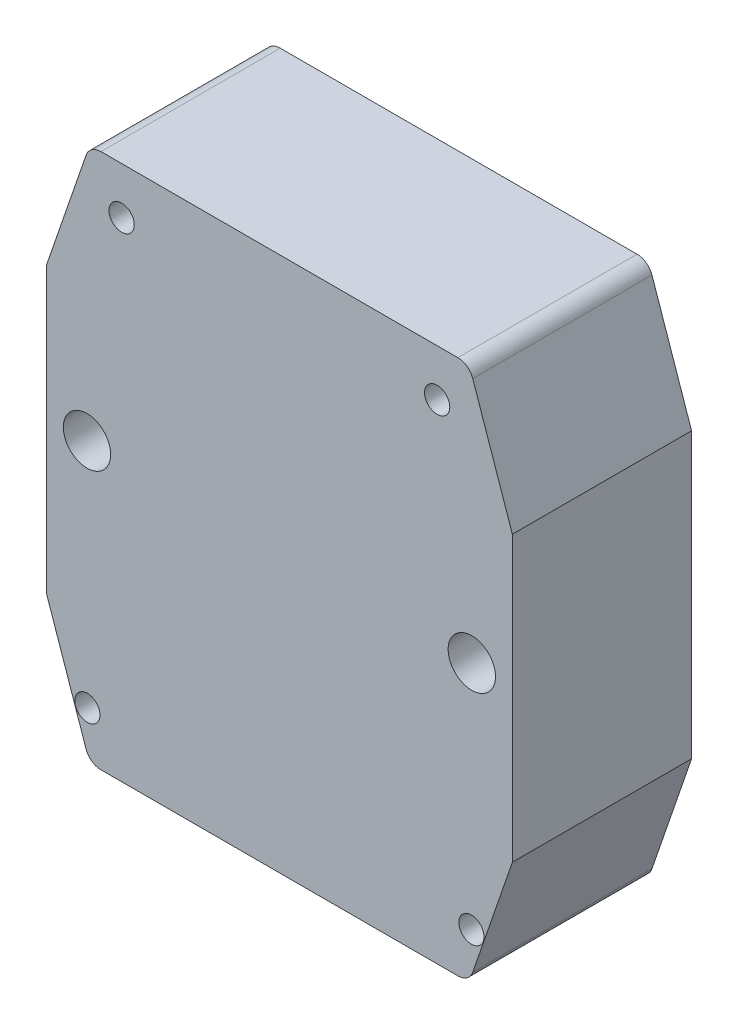
ISO-10303-21;
HEADER;
FILE_DESCRIPTION(('STEP AP214'),'2;1');
FILE_NAME('part.step','',(''),(''),'','','');
FILE_SCHEMA(('AUTOMOTIVE_DESIGN { 1 0 10303 214 1 1 1 1 }'));
ENDSEC;
DATA;
#1=APPLICATION_CONTEXT('core data for automotive mechanical design processes');
#2=APPLICATION_PROTOCOL_DEFINITION('international standard','automotive_design',2000,#1);
#3=PRODUCT_CONTEXT('',#1,'mechanical');
#4=PRODUCT('Part','Part','',(#3));
#5=PRODUCT_RELATED_PRODUCT_CATEGORY('part','',(#4));
#6=PRODUCT_DEFINITION_FORMATION('','',#4);
#7=PRODUCT_DEFINITION_CONTEXT('part definition',#1,'design');
#8=PRODUCT_DEFINITION('design','',#6,#7);
#9=PRODUCT_DEFINITION_SHAPE('','',#8);
#10=(LENGTH_UNIT() NAMED_UNIT(*) SI_UNIT(.MILLI.,.METRE.));
#11=(NAMED_UNIT(*) PLANE_ANGLE_UNIT() SI_UNIT($,.RADIAN.));
#12=(NAMED_UNIT(*) SI_UNIT($,.STERADIAN.) SOLID_ANGLE_UNIT());
#13=UNCERTAINTY_MEASURE_WITH_UNIT(LENGTH_MEASURE(1.E-05),#10,'distance_accuracy_value','');
#14=(GEOMETRIC_REPRESENTATION_CONTEXT(3) GLOBAL_UNCERTAINTY_ASSIGNED_CONTEXT((#13)) GLOBAL_UNIT_ASSIGNED_CONTEXT((#10,
#11,#12)) REPRESENTATION_CONTEXT('',''));
#15=CARTESIAN_POINT('',(0.,0.,0.));
#16=DIRECTION('',(0.,0.,1.));
#17=DIRECTION('',(1.,0.,0.));
#18=AXIS2_PLACEMENT_3D('',#15,#16,#17);
#19=CARTESIAN_POINT('',(54.423010455942,-27.3603734468019,36.068));
#20=DIRECTION('',(0.,0.,-1.));
#21=DIRECTION('',(-1.,0.,0.));
#22=AXIS2_PLACEMENT_3D('',#19,#20,#21);
#23=PLANE('',#22);
#24=DIRECTION('',(0.,1.,0.));
#25=VECTOR('',#24,1.);
#26=CARTESIAN_POINT('',(65.395995047322,51.9232876627966,36.068));
#27=LINE('',#26,#25);
#28=CARTESIAN_POINT('',(65.395995047322,-5.2446945564005,36.068));
#29=VERTEX_POINT('',#28);
#30=CARTESIAN_POINT('',(65.395995047322,51.9232876627966,36.068));
#31=VERTEX_POINT('',#30);
#32=EDGE_CURVE('E187',#29,#31,#27,.T.);
#33=ORIENTED_EDGE('',*,*,#32,.T.);
#34=DIRECTION('',(-0.325568154457148,0.94551857559932,0.));
#35=VECTOR('',#34,1.);
#36=CARTESIAN_POINT('',(65.395995047322,51.9232876627966,36.068));
#37=LINE('',#36,#35);
#38=CARTESIAN_POINT('',(57.4250319334698,75.0726454435995,36.068));
#39=VERTEX_POINT('',#38);
#40=EDGE_CURVE('E110',#31,#39,#37,.T.);
#41=ORIENTED_EDGE('',*,*,#40,.T.);
#42=CARTESIAN_POINT('',(54.423010455942,74.038966553198,36.068));
#43=DIRECTION('',(0.,0.,1.));
#44=DIRECTION('',(1.,0.,0.));
#45=AXIS2_PLACEMENT_3D('',#42,#43,#44);
#46=CIRCLE('',#45,3.17499999999998);
#47=CARTESIAN_POINT('',(54.423010455942,77.213966553198,36.068));
#48=VERTEX_POINT('',#47);
#49=EDGE_CURVE('E216',#39,#48,#46,.T.);
#50=ORIENTED_EDGE('',*,*,#49,.T.);
#51=DIRECTION('',(-1.,0.,0.));
#52=VECTOR('',#51,1.);
#53=CARTESIAN_POINT('',(54.423010455942,77.213966553198,36.068));
#54=LINE('',#53,#52);
#55=CARTESIAN_POINT('',(-17.4063883873884,77.213966553198,36.068));
#56=VERTEX_POINT('',#55);
#57=EDGE_CURVE('E235',#48,#56,#54,.T.);
#58=ORIENTED_EDGE('',*,*,#57,.T.);
#59=CARTESIAN_POINT('',(-17.4063883873884,74.0389665531981,36.068));
#60=DIRECTION('',(0.,0.,1.));
#61=DIRECTION('',(1.,0.,0.));
#62=AXIS2_PLACEMENT_3D('',#59,#60,#61);
#63=CIRCLE('',#62,3.17499999999998);
#64=CARTESIAN_POINT('',(-20.4084098649163,75.0726454435995,36.068));
#65=VERTEX_POINT('',#64);
#66=EDGE_CURVE('E232',#56,#65,#63,.T.);
#67=ORIENTED_EDGE('',*,*,#66,.T.);
#68=DIRECTION('',(-0.325568154457149,-0.94551857559932,0.));
#69=VECTOR('',#68,1.);
#70=CARTESIAN_POINT('',(-20.4084098649163,75.0726454435995,36.068));
#71=LINE('',#70,#69);
#72=CARTESIAN_POINT('',(-28.3793729787685,51.9232876627966,36.068));
#73=VERTEX_POINT('',#72);
#74=EDGE_CURVE('E234',#65,#73,#71,.T.);
#75=ORIENTED_EDGE('',*,*,#74,.T.);
#76=DIRECTION('',(0.,-1.,0.));
#77=VECTOR('',#76,1.);
#78=CARTESIAN_POINT('',(-28.3793729787685,51.9232876627966,36.068));
#79=LINE('',#78,#77);
#80=CARTESIAN_POINT('',(-28.3793729787685,-5.24469455640049,36.068));
#81=VERTEX_POINT('',#80);
#82=EDGE_CURVE('E237',#73,#81,#79,.T.);
#83=ORIENTED_EDGE('',*,*,#82,.T.);
#84=DIRECTION('',(0.325568154457149,-0.94551857559932,0.));
#85=VECTOR('',#84,1.);
#86=CARTESIAN_POINT('',(-20.4084098649163,-28.3940523372034,36.068));
#87=LINE('',#86,#85);
#88=CARTESIAN_POINT('',(-20.4084098649163,-28.3940523372034,36.068));
#89=VERTEX_POINT('',#88);
#90=EDGE_CURVE('E243',#81,#89,#87,.T.);
#91=ORIENTED_EDGE('',*,*,#90,.T.);
#92=CARTESIAN_POINT('',(-17.4063883873884,-27.3603734468019,36.068));
#93=DIRECTION('',(0.,0.,1.));
#94=DIRECTION('',(-1.,0.,0.));
#95=AXIS2_PLACEMENT_3D('',#92,#93,#94);
#96=CIRCLE('',#95,3.17499999999998);
#97=CARTESIAN_POINT('',(-17.4063883873884,-30.5353734468019,36.068));
#98=VERTEX_POINT('',#97);
#99=EDGE_CURVE('E142',#89,#98,#96,.T.);
#100=ORIENTED_EDGE('',*,*,#99,.T.);
#101=DIRECTION('',(1.,0.,0.));
#102=VECTOR('',#101,1.);
#103=CARTESIAN_POINT('',(54.423010455942,-30.5353734468019,36.068));
#104=LINE('',#103,#102);
#105=CARTESIAN_POINT('',(54.423010455942,-30.5353734468019,36.068));
#106=VERTEX_POINT('',#105);
#107=EDGE_CURVE('E136',#98,#106,#104,.T.);
#108=ORIENTED_EDGE('',*,*,#107,.T.);
#109=CARTESIAN_POINT('',(54.423010455942,-27.3603734468019,36.068));
#110=DIRECTION('',(0.,0.,1.));
#111=DIRECTION('',(-1.,0.,0.));
#112=AXIS2_PLACEMENT_3D('',#109,#110,#111);
#113=CIRCLE('',#112,3.17500000000001);
#114=CARTESIAN_POINT('',(57.4250319334699,-28.3940523372034,36.068));
#115=VERTEX_POINT('',#114);
#116=EDGE_CURVE('E140',#106,#115,#113,.T.);
#117=ORIENTED_EDGE('',*,*,#116,.T.);
#118=DIRECTION('',(0.325568154457148,0.94551857559932,0.));
#119=VECTOR('',#118,1.);
#120=CARTESIAN_POINT('',(65.395995047322,-5.2446945564005,36.068));
#121=LINE('',#120,#119);
#122=EDGE_CURVE('E55',#115,#29,#121,.T.);
#123=ORIENTED_EDGE('',*,*,#122,.T.);
#124=EDGE_LOOP('',(#33,#41,#50,#58,#67,#75,#83,#91,#100,#108,#117,#123));
#125=FACE_BOUND('',#124,.T.);
#126=CARTESIAN_POINT('',(-13.2416889657233,67.7854865531981,36.068));
#127=DIRECTION('',(0.,0.,1.));
#128=DIRECTION('',(1.,0.,0.));
#129=AXIS2_PLACEMENT_3D('',#126,#127,#128);
#130=CIRCLE('',#129,2.54000000000001);
#131=CARTESIAN_POINT('',(-10.7016889657232,67.7854865531981,36.068));
#132=VERTEX_POINT('',#131);
#133=EDGE_CURVE('E168',#132,#132,#130,.T.);
#134=ORIENTED_EDGE('',*,*,#133,.F.);
#135=EDGE_LOOP('',(#134));
#136=FACE_BOUND('',#135,.T.);
#137=CARTESIAN_POINT('',(50.2583110342768,67.7854865531981,36.068));
#138=DIRECTION('',(0.,0.,1.));
#139=DIRECTION('',(1.,0.,0.));
#140=AXIS2_PLACEMENT_3D('',#137,#138,#139);
#141=CIRCLE('',#140,2.54);
#142=CARTESIAN_POINT('',(52.7983110342768,67.7854865531981,36.068));
#143=VERTEX_POINT('',#142);
#144=EDGE_CURVE('E329',#143,#143,#141,.T.);
#145=ORIENTED_EDGE('',*,*,#144,.F.);
#146=EDGE_LOOP('',(#145));
#147=FACE_BOUND('',#146,.T.);
#148=CARTESIAN_POINT('',(-20.1377889657233,-21.1068934468019,36.068));
#149=DIRECTION('',(0.,0.,1.));
#150=DIRECTION('',(1.,0.,0.));
#151=AXIS2_PLACEMENT_3D('',#148,#149,#150);
#152=CIRCLE('',#151,2.54000000000001);
#153=CARTESIAN_POINT('',(-17.5977889657233,-21.1068934468019,36.068));
#154=VERTEX_POINT('',#153);
#155=EDGE_CURVE('E323',#154,#154,#152,.T.);
#156=ORIENTED_EDGE('',*,*,#155,.F.);
#157=EDGE_LOOP('',(#156));
#158=FACE_BOUND('',#157,.T.);
#159=CARTESIAN_POINT('',(57.1544110342768,-21.1068934468019,36.068));
#160=DIRECTION('',(0.,0.,1.));
#161=DIRECTION('',(1.,0.,0.));
#162=AXIS2_PLACEMENT_3D('',#159,#160,#161);
#163=CIRCLE('',#162,2.54000000000001);
#164=CARTESIAN_POINT('',(59.6944110342768,-21.1068934468019,36.068));
#165=VERTEX_POINT('',#164);
#166=EDGE_CURVE('E316',#165,#165,#163,.T.);
#167=ORIENTED_EDGE('',*,*,#166,.F.);
#168=EDGE_LOOP('',(#167));
#169=FACE_BOUND('',#168,.T.);
#170=CARTESIAN_POINT('',(-20.2159861756146,25.3979665531981,36.068));
#171=DIRECTION('',(0.,0.,1.));
#172=DIRECTION('',(1.,0.,0.));
#173=AXIS2_PLACEMENT_3D('',#170,#171,#172);
#174=CIRCLE('',#173,4.76250000000001);
#175=CARTESIAN_POINT('',(-15.4534861756146,25.3979665531981,36.068));
#176=VERTEX_POINT('',#175);
#177=EDGE_CURVE('E310',#176,#176,#174,.T.);
#178=ORIENTED_EDGE('',*,*,#177,.F.);
#179=EDGE_LOOP('',(#178));
#180=FACE_BOUND('',#179,.T.);
#181=CARTESIAN_POINT('',(57.2326082441681,25.3979665531981,36.068));
#182=DIRECTION('',(0.,0.,1.));
#183=DIRECTION('',(1.,0.,0.));
#184=AXIS2_PLACEMENT_3D('',#181,#182,#183);
#185=CIRCLE('',#184,4.76250000000001);
#186=CARTESIAN_POINT('',(61.9951082441681,25.3979665531981,36.068));
#187=VERTEX_POINT('',#186);
#188=EDGE_CURVE('E300',#187,#187,#185,.T.);
#189=ORIENTED_EDGE('',*,*,#188,.F.);
#190=EDGE_LOOP('',(#189));
#191=FACE_BOUND('',#190,.T.);
#192=ADVANCED_FACE('F36',(#125,#136,#147,#158,#169,#180,#191),#23,.F.);
#193=CARTESIAN_POINT('',(54.423010455942,-27.3603734468019,0.));
#194=DIRECTION('',(0.,0.,-1.));
#195=DIRECTION('',(-1.,0.,0.));
#196=AXIS2_PLACEMENT_3D('',#193,#194,#195);
#197=PLANE('',#196);
#198=CARTESIAN_POINT('',(-20.2159861756146,25.3979665531981,0.));
#199=DIRECTION('',(0.,0.,1.));
#200=DIRECTION('',(1.,0.,0.));
#201=AXIS2_PLACEMENT_3D('',#198,#199,#200);
#202=CIRCLE('',#201,4.76250000000001);
#203=CARTESIAN_POINT('',(-15.4534861756146,25.3979665531981,0.));
#204=VERTEX_POINT('',#203);
#205=EDGE_CURVE('E307',#204,#204,#202,.T.);
#206=ORIENTED_EDGE('',*,*,#205,.T.);
#207=EDGE_LOOP('',(#206));
#208=FACE_BOUND('',#207,.T.);
#209=CARTESIAN_POINT('',(-20.1377889657233,-21.1068934468019,0.));
#210=DIRECTION('',(0.,0.,1.));
#211=DIRECTION('',(1.,0.,0.));
#212=AXIS2_PLACEMENT_3D('',#209,#210,#211);
#213=CIRCLE('',#212,2.54000000000001);
#214=CARTESIAN_POINT('',(-17.5977889657233,-21.1068934468019,0.));
#215=VERTEX_POINT('',#214);
#216=EDGE_CURVE('E320',#215,#215,#213,.T.);
#217=ORIENTED_EDGE('',*,*,#216,.T.);
#218=EDGE_LOOP('',(#217));
#219=FACE_BOUND('',#218,.T.);
#220=CARTESIAN_POINT('',(-13.2416889657233,67.7854865531981,0.));
#221=DIRECTION('',(0.,0.,1.));
#222=DIRECTION('',(1.,0.,0.));
#223=AXIS2_PLACEMENT_3D('',#220,#221,#222);
#224=CIRCLE('',#223,2.54000000000001);
#225=CARTESIAN_POINT('',(-10.7016889657232,67.7854865531981,0.));
#226=VERTEX_POINT('',#225);
#227=EDGE_CURVE('E332',#226,#226,#224,.T.);
#228=ORIENTED_EDGE('',*,*,#227,.T.);
#229=EDGE_LOOP('',(#228));
#230=FACE_BOUND('',#229,.T.);
#231=DIRECTION('',(0.,1.,0.));
#232=VECTOR('',#231,1.);
#233=CARTESIAN_POINT('',(65.395995047322,51.9232876627966,0.));
#234=LINE('',#233,#232);
#235=CARTESIAN_POINT('',(65.395995047322,-5.2446945564005,0.));
#236=VERTEX_POINT('',#235);
#237=CARTESIAN_POINT('',(65.395995047322,51.9232876627966,0.));
#238=VERTEX_POINT('',#237);
#239=EDGE_CURVE('E164',#236,#238,#234,.T.);
#240=ORIENTED_EDGE('',*,*,#239,.F.);
#241=DIRECTION('',(0.325568154457148,0.94551857559932,0.));
#242=VECTOR('',#241,1.);
#243=CARTESIAN_POINT('',(65.395995047322,-5.2446945564005,0.));
#244=LINE('',#243,#242);
#245=CARTESIAN_POINT('',(57.4250319334699,-28.3940523372034,0.));
#246=VERTEX_POINT('',#245);
#247=EDGE_CURVE('E102',#246,#236,#244,.T.);
#248=ORIENTED_EDGE('',*,*,#247,.F.);
#249=CARTESIAN_POINT('',(54.423010455942,-27.3603734468019,0.));
#250=DIRECTION('',(0.,0.,1.));
#251=DIRECTION('',(-1.,0.,0.));
#252=AXIS2_PLACEMENT_3D('',#249,#250,#251);
#253=CIRCLE('',#252,3.17500000000001);
#254=CARTESIAN_POINT('',(54.423010455942,-30.5353734468019,0.));
#255=VERTEX_POINT('',#254);
#256=EDGE_CURVE('E96',#255,#246,#253,.T.);
#257=ORIENTED_EDGE('',*,*,#256,.F.);
#258=DIRECTION('',(1.,0.,0.));
#259=VECTOR('',#258,1.);
#260=CARTESIAN_POINT('',(54.423010455942,-30.5353734468019,0.));
#261=LINE('',#260,#259);
#262=CARTESIAN_POINT('',(-17.4063883873884,-30.5353734468019,0.));
#263=VERTEX_POINT('',#262);
#264=EDGE_CURVE('E151',#263,#255,#261,.T.);
#265=ORIENTED_EDGE('',*,*,#264,.F.);
#266=CARTESIAN_POINT('',(-17.4063883873884,-27.3603734468019,0.));
#267=DIRECTION('',(0.,0.,1.));
#268=DIRECTION('',(-1.,0.,0.));
#269=AXIS2_PLACEMENT_3D('',#266,#267,#268);
#270=CIRCLE('',#269,3.17499999999998);
#271=CARTESIAN_POINT('',(-20.4084098649163,-28.3940523372034,0.));
#272=VERTEX_POINT('',#271);
#273=EDGE_CURVE('E182',#272,#263,#270,.T.);
#274=ORIENTED_EDGE('',*,*,#273,.F.);
#275=DIRECTION('',(0.325568154457149,-0.94551857559932,0.));
#276=VECTOR('',#275,1.);
#277=CARTESIAN_POINT('',(-20.4084098649163,-28.3940523372034,0.));
#278=LINE('',#277,#276);
#279=CARTESIAN_POINT('',(-28.3793729787685,-5.24469455640049,0.));
#280=VERTEX_POINT('',#279);
#281=EDGE_CURVE('E180',#280,#272,#278,.T.);
#282=ORIENTED_EDGE('',*,*,#281,.F.);
#283=DIRECTION('',(0.,-1.,0.));
#284=VECTOR('',#283,1.);
#285=CARTESIAN_POINT('',(-28.3793729787685,51.9232876627966,0.));
#286=LINE('',#285,#284);
#287=CARTESIAN_POINT('',(-28.3793729787685,51.9232876627966,0.));
#288=VERTEX_POINT('',#287);
#289=EDGE_CURVE('E178',#288,#280,#286,.T.);
#290=ORIENTED_EDGE('',*,*,#289,.F.);
#291=DIRECTION('',(-0.325568154457149,-0.94551857559932,0.));
#292=VECTOR('',#291,1.);
#293=CARTESIAN_POINT('',(-20.4084098649163,75.0726454435995,0.));
#294=LINE('',#293,#292);
#295=CARTESIAN_POINT('',(-20.4084098649163,75.0726454435995,0.));
#296=VERTEX_POINT('',#295);
#297=EDGE_CURVE('E176',#296,#288,#294,.T.);
#298=ORIENTED_EDGE('',*,*,#297,.F.);
#299=CARTESIAN_POINT('',(-17.4063883873884,74.0389665531981,0.));
#300=DIRECTION('',(0.,0.,1.));
#301=DIRECTION('',(1.,0.,0.));
#302=AXIS2_PLACEMENT_3D('',#299,#300,#301);
#303=CIRCLE('',#302,3.17499999999998);
#304=CARTESIAN_POINT('',(-17.4063883873884,77.213966553198,0.));
#305=VERTEX_POINT('',#304);
#306=EDGE_CURVE('E174',#305,#296,#303,.T.);
#307=ORIENTED_EDGE('',*,*,#306,.F.);
#308=DIRECTION('',(-1.,0.,0.));
#309=VECTOR('',#308,1.);
#310=CARTESIAN_POINT('',(54.423010455942,77.213966553198,0.));
#311=LINE('',#310,#309);
#312=CARTESIAN_POINT('',(54.423010455942,77.213966553198,0.));
#313=VERTEX_POINT('',#312);
#314=EDGE_CURVE('E172',#313,#305,#311,.T.);
#315=ORIENTED_EDGE('',*,*,#314,.F.);
#316=CARTESIAN_POINT('',(54.423010455942,74.038966553198,0.));
#317=DIRECTION('',(0.,0.,1.));
#318=DIRECTION('',(1.,0.,0.));
#319=AXIS2_PLACEMENT_3D('',#316,#317,#318);
#320=CIRCLE('',#319,3.17499999999998);
#321=CARTESIAN_POINT('',(57.4250319334698,75.0726454435995,0.));
#322=VERTEX_POINT('',#321);
#323=EDGE_CURVE('E170',#322,#313,#320,.T.);
#324=ORIENTED_EDGE('',*,*,#323,.F.);
#325=DIRECTION('',(-0.325568154457148,0.94551857559932,0.));
#326=VECTOR('',#325,1.);
#327=CARTESIAN_POINT('',(65.395995047322,51.9232876627966,0.));
#328=LINE('',#327,#326);
#329=EDGE_CURVE('E167',#238,#322,#328,.T.);
#330=ORIENTED_EDGE('',*,*,#329,.F.);
#331=EDGE_LOOP('',(#240,#248,#257,#265,#274,#282,#290,#298,#307,#315,#324,#330));
#332=FACE_BOUND('',#331,.T.);
#333=CARTESIAN_POINT('',(50.2583110342768,67.7854865531981,0.));
#334=DIRECTION('',(0.,0.,1.));
#335=DIRECTION('',(1.,0.,0.));
#336=AXIS2_PLACEMENT_3D('',#333,#334,#335);
#337=CIRCLE('',#336,2.54);
#338=CARTESIAN_POINT('',(52.7983110342768,67.7854865531981,0.));
#339=VERTEX_POINT('',#338);
#340=EDGE_CURVE('E326',#339,#339,#337,.T.);
#341=ORIENTED_EDGE('',*,*,#340,.T.);
#342=EDGE_LOOP('',(#341));
#343=FACE_BOUND('',#342,.T.);
#344=CARTESIAN_POINT('',(57.1544110342768,-21.1068934468019,0.));
#345=DIRECTION('',(0.,0.,1.));
#346=DIRECTION('',(1.,0.,0.));
#347=AXIS2_PLACEMENT_3D('',#344,#345,#346);
#348=CIRCLE('',#347,2.54000000000001);
#349=CARTESIAN_POINT('',(59.6944110342768,-21.1068934468019,0.));
#350=VERTEX_POINT('',#349);
#351=EDGE_CURVE('E313',#350,#350,#348,.T.);
#352=ORIENTED_EDGE('',*,*,#351,.T.);
#353=EDGE_LOOP('',(#352));
#354=FACE_BOUND('',#353,.T.);
#355=CARTESIAN_POINT('',(57.2326082441681,25.3979665531981,0.));
#356=DIRECTION('',(0.,0.,1.));
#357=DIRECTION('',(1.,0.,0.));
#358=AXIS2_PLACEMENT_3D('',#355,#356,#357);
#359=CIRCLE('',#358,4.76250000000001);
#360=CARTESIAN_POINT('',(61.9951082441681,25.3979665531981,0.));
#361=VERTEX_POINT('',#360);
#362=EDGE_CURVE('E303',#361,#361,#359,.T.);
#363=ORIENTED_EDGE('',*,*,#362,.T.);
#364=EDGE_LOOP('',(#363));
#365=FACE_BOUND('',#364,.T.);
#366=ADVANCED_FACE('F220',(#208,#219,#230,#332,#343,#354,#365),#197,.T.);
#367=CARTESIAN_POINT('',(65.395995047322,51.9232876627966,36.068));
#368=DIRECTION('',(-1.,0.,0.));
#369=DIRECTION('',(0.,-1.,0.));
#370=AXIS2_PLACEMENT_3D('',#367,#368,#369);
#371=PLANE('',#370);
#372=ORIENTED_EDGE('',*,*,#239,.T.);
#373=DIRECTION('',(0.,0.,-1.));
#374=VECTOR('',#373,1.);
#375=CARTESIAN_POINT('',(65.395995047322,51.9232876627966,36.068));
#376=LINE('',#375,#374);
#377=EDGE_CURVE('E11',#31,#238,#376,.T.);
#378=ORIENTED_EDGE('',*,*,#377,.F.);
#379=ORIENTED_EDGE('',*,*,#32,.F.);
#380=DIRECTION('',(0.,0.,-1.));
#381=VECTOR('',#380,1.);
#382=CARTESIAN_POINT('',(65.395995047322,-5.2446945564005,36.068));
#383=LINE('',#382,#381);
#384=EDGE_CURVE('E160',#29,#236,#383,.T.);
#385=ORIENTED_EDGE('',*,*,#384,.T.);
#386=EDGE_LOOP('',(#372,#378,#379,#385));
#387=FACE_BOUND('',#386,.T.);
#388=ADVANCED_FACE('F38',(#387),#371,.F.);
#389=CARTESIAN_POINT('',(65.395995047322,51.9232876627966,36.068));
#390=DIRECTION('',(-0.94551857559932,-0.325568154457148,0.));
#391=DIRECTION('',(0.325568154457148,-0.94551857559932,0.));
#392=AXIS2_PLACEMENT_3D('',#389,#390,#391);
#393=PLANE('',#392);
#394=ORIENTED_EDGE('',*,*,#329,.T.);
#395=DIRECTION('',(0.,0.,-1.));
#396=VECTOR('',#395,1.);
#397=CARTESIAN_POINT('',(57.4250319334698,75.0726454435995,36.068));
#398=LINE('',#397,#396);
#399=EDGE_CURVE('E45',#39,#322,#398,.T.);
#400=ORIENTED_EDGE('',*,*,#399,.F.);
#401=ORIENTED_EDGE('',*,*,#40,.F.);
#402=ORIENTED_EDGE('',*,*,#377,.T.);
#403=EDGE_LOOP('',(#394,#400,#401,#402));
#404=FACE_BOUND('',#403,.T.);
#405=ADVANCED_FACE('F463',(#404),#393,.F.);
#406=CARTESIAN_POINT('',(54.423010455942,74.038966553198,36.068));
#407=DIRECTION('',(0.,0.,-1.));
#408=DIRECTION('',(-1.,0.,0.));
#409=AXIS2_PLACEMENT_3D('',#406,#407,#408);
#410=CYLINDRICAL_SURFACE('',#409,3.17499999999998);
#411=ORIENTED_EDGE('',*,*,#323,.T.);
#412=DIRECTION('',(0.,0.,-1.));
#413=VECTOR('',#412,1.);
#414=CARTESIAN_POINT('',(54.423010455942,77.213966553198,36.068));
#415=LINE('',#414,#413);
#416=EDGE_CURVE('E208',#48,#313,#415,.T.);
#417=ORIENTED_EDGE('',*,*,#416,.F.);
#418=ORIENTED_EDGE('',*,*,#49,.F.);
#419=ORIENTED_EDGE('',*,*,#399,.T.);
#420=EDGE_LOOP('',(#411,#417,#418,#419));
#421=FACE_BOUND('',#420,.T.);
#422=ADVANCED_FACE('F214',(#421),#410,.T.);
#423=CARTESIAN_POINT('',(54.423010455942,77.213966553198,36.068));
#424=DIRECTION('',(0.,-1.,0.));
#425=DIRECTION('',(1.,0.,0.));
#426=AXIS2_PLACEMENT_3D('',#423,#424,#425);
#427=PLANE('',#426);
#428=ORIENTED_EDGE('',*,*,#314,.T.);
#429=DIRECTION('',(0.,0.,-1.));
#430=VECTOR('',#429,1.);
#431=CARTESIAN_POINT('',(-17.4063883873884,77.213966553198,36.068));
#432=LINE('',#431,#430);
#433=EDGE_CURVE('E205',#56,#305,#432,.T.);
#434=ORIENTED_EDGE('',*,*,#433,.F.);
#435=ORIENTED_EDGE('',*,*,#57,.F.);
#436=ORIENTED_EDGE('',*,*,#416,.T.);
#437=EDGE_LOOP('',(#428,#434,#435,#436));
#438=FACE_BOUND('',#437,.T.);
#439=ADVANCED_FACE('F226',(#438),#427,.F.);
#440=CARTESIAN_POINT('',(-17.4063883873884,74.0389665531981,36.068));
#441=DIRECTION('',(0.,0.,-1.));
#442=DIRECTION('',(-1.,0.,0.));
#443=AXIS2_PLACEMENT_3D('',#440,#441,#442);
#444=CYLINDRICAL_SURFACE('',#443,3.17499999999998);
#445=ORIENTED_EDGE('',*,*,#306,.T.);
#446=DIRECTION('',(0.,0.,-1.));
#447=VECTOR('',#446,1.);
#448=CARTESIAN_POINT('',(-20.4084098649163,75.0726454435995,36.068));
#449=LINE('',#448,#447);
#450=EDGE_CURVE('E202',#65,#296,#449,.T.);
#451=ORIENTED_EDGE('',*,*,#450,.F.);
#452=ORIENTED_EDGE('',*,*,#66,.F.);
#453=ORIENTED_EDGE('',*,*,#433,.T.);
#454=EDGE_LOOP('',(#445,#451,#452,#453));
#455=FACE_BOUND('',#454,.T.);
#456=ADVANCED_FACE('F230',(#455),#444,.T.);
#457=CARTESIAN_POINT('',(-20.4084098649163,75.0726454435995,36.068));
#458=DIRECTION('',(0.945518575599319,-0.325568154457149,0.));
#459=DIRECTION('',(0.325568154457149,0.945518575599319,0.));
#460=AXIS2_PLACEMENT_3D('',#457,#458,#459);
#461=PLANE('',#460);
#462=ORIENTED_EDGE('',*,*,#297,.T.);
#463=DIRECTION('',(0.,0.,-1.));
#464=VECTOR('',#463,1.);
#465=CARTESIAN_POINT('',(-28.3793729787685,51.9232876627966,36.068));
#466=LINE('',#465,#464);
#467=EDGE_CURVE('E199',#73,#288,#466,.T.);
#468=ORIENTED_EDGE('',*,*,#467,.F.);
#469=ORIENTED_EDGE('',*,*,#74,.F.);
#470=ORIENTED_EDGE('',*,*,#450,.T.);
#471=EDGE_LOOP('',(#462,#468,#469,#470));
#472=FACE_BOUND('',#471,.T.);
#473=ADVANCED_FACE('F428',(#472),#461,.F.);
#474=CARTESIAN_POINT('',(-28.3793729787685,51.9232876627966,36.068));
#475=DIRECTION('',(1.,0.,0.));
#476=DIRECTION('',(0.,0.,-1.));
#477=AXIS2_PLACEMENT_3D('',#474,#475,#476);
#478=PLANE('',#477);
#479=ORIENTED_EDGE('',*,*,#289,.T.);
#480=DIRECTION('',(0.,0.,-1.));
#481=VECTOR('',#480,1.);
#482=CARTESIAN_POINT('',(-28.3793729787685,-5.24469455640049,36.068));
#483=LINE('',#482,#481);
#484=EDGE_CURVE('E196',#81,#280,#483,.T.);
#485=ORIENTED_EDGE('',*,*,#484,.F.);
#486=ORIENTED_EDGE('',*,*,#82,.F.);
#487=ORIENTED_EDGE('',*,*,#467,.T.);
#488=EDGE_LOOP('',(#479,#485,#486,#487));
#489=FACE_BOUND('',#488,.T.);
#490=ADVANCED_FACE('F419',(#489),#478,.F.);
#491=CARTESIAN_POINT('',(-20.4084098649163,-28.3940523372034,36.068));
#492=DIRECTION('',(0.945518575599319,0.325568154457149,0.));
#493=DIRECTION('',(-0.325568154457149,0.945518575599319,0.));
#494=AXIS2_PLACEMENT_3D('',#491,#492,#493);
#495=PLANE('',#494);
#496=ORIENTED_EDGE('',*,*,#281,.T.);
#497=DIRECTION('',(0.,0.,-1.));
#498=VECTOR('',#497,1.);
#499=CARTESIAN_POINT('',(-20.4084098649163,-28.3940523372034,36.068));
#500=LINE('',#499,#498);
#501=EDGE_CURVE('E193',#89,#272,#500,.T.);
#502=ORIENTED_EDGE('',*,*,#501,.F.);
#503=ORIENTED_EDGE('',*,*,#90,.F.);
#504=ORIENTED_EDGE('',*,*,#484,.T.);
#505=EDGE_LOOP('',(#496,#502,#503,#504));
#506=FACE_BOUND('',#505,.T.);
#507=ADVANCED_FACE('F249',(#506),#495,.F.);
#508=CARTESIAN_POINT('',(-17.4063883873884,-27.3603734468019,36.068));
#509=DIRECTION('',(0.,0.,-1.));
#510=DIRECTION('',(-1.,0.,0.));
#511=AXIS2_PLACEMENT_3D('',#508,#509,#510);
#512=CYLINDRICAL_SURFACE('',#511,3.17499999999998);
#513=ORIENTED_EDGE('',*,*,#273,.T.);
#514=DIRECTION('',(0.,0.,-1.));
#515=VECTOR('',#514,1.);
#516=CARTESIAN_POINT('',(-17.4063883873884,-30.5353734468019,36.068));
#517=LINE('',#516,#515);
#518=EDGE_CURVE('E153',#98,#263,#517,.T.);
#519=ORIENTED_EDGE('',*,*,#518,.F.);
#520=ORIENTED_EDGE('',*,*,#99,.F.);
#521=ORIENTED_EDGE('',*,*,#501,.T.);
#522=EDGE_LOOP('',(#513,#519,#520,#521));
#523=FACE_BOUND('',#522,.T.);
#524=ADVANCED_FACE('F253',(#523),#512,.T.);
#525=CARTESIAN_POINT('',(54.423010455942,-30.5353734468019,36.068));
#526=DIRECTION('',(0.,1.,0.));
#527=DIRECTION('',(0.,0.,1.));
#528=AXIS2_PLACEMENT_3D('',#525,#526,#527);
#529=PLANE('',#528);
#530=ORIENTED_EDGE('',*,*,#264,.T.);
#531=DIRECTION('',(0.,0.,-1.));
#532=VECTOR('',#531,1.);
#533=CARTESIAN_POINT('',(54.423010455942,-30.5353734468019,36.068));
#534=LINE('',#533,#532);
#535=EDGE_CURVE('E148',#106,#255,#534,.T.);
#536=ORIENTED_EDGE('',*,*,#535,.F.);
#537=ORIENTED_EDGE('',*,*,#107,.F.);
#538=ORIENTED_EDGE('',*,*,#518,.T.);
#539=EDGE_LOOP('',(#530,#536,#537,#538));
#540=FACE_BOUND('',#539,.T.);
#541=ADVANCED_FACE('F149',(#540),#529,.F.);
#542=CARTESIAN_POINT('',(54.423010455942,-27.3603734468019,36.068));
#543=DIRECTION('',(0.,0.,-1.));
#544=DIRECTION('',(-1.,0.,0.));
#545=AXIS2_PLACEMENT_3D('',#542,#543,#544);
#546=CYLINDRICAL_SURFACE('',#545,3.17500000000001);
#547=ORIENTED_EDGE('',*,*,#256,.T.);
#548=DIRECTION('',(0.,0.,-1.));
#549=VECTOR('',#548,1.);
#550=CARTESIAN_POINT('',(57.4250319334699,-28.3940523372034,36.068));
#551=LINE('',#550,#549);
#552=EDGE_CURVE('E154',#115,#246,#551,.T.);
#553=ORIENTED_EDGE('',*,*,#552,.F.);
#554=ORIENTED_EDGE('',*,*,#116,.F.);
#555=ORIENTED_EDGE('',*,*,#535,.T.);
#556=EDGE_LOOP('',(#547,#553,#554,#555));
#557=FACE_BOUND('',#556,.T.);
#558=ADVANCED_FACE('F156',(#557),#546,.T.);
#559=CARTESIAN_POINT('',(65.395995047322,-5.2446945564005,36.068));
#560=DIRECTION('',(-0.94551857559932,0.325568154457148,0.));
#561=DIRECTION('',(-0.325568154457148,-0.94551857559932,0.));
#562=AXIS2_PLACEMENT_3D('',#559,#560,#561);
#563=PLANE('',#562);
#564=ORIENTED_EDGE('',*,*,#247,.T.);
#565=ORIENTED_EDGE('',*,*,#384,.F.);
#566=ORIENTED_EDGE('',*,*,#122,.F.);
#567=ORIENTED_EDGE('',*,*,#552,.T.);
#568=EDGE_LOOP('',(#564,#565,#566,#567));
#569=FACE_BOUND('',#568,.T.);
#570=ADVANCED_FACE('F257',(#569),#563,.F.);
#571=CARTESIAN_POINT('',(-13.2416889657233,67.7854865531981,36.068));
#572=DIRECTION('',(0.,0.,-1.));
#573=DIRECTION('',(-1.,0.,0.));
#574=AXIS2_PLACEMENT_3D('',#571,#572,#573);
#575=CYLINDRICAL_SURFACE('',#574,2.54000000000001);
#576=ORIENTED_EDGE('',*,*,#133,.T.);
#577=EDGE_LOOP('',(#576));
#578=FACE_BOUND('',#577,.T.);
#579=ORIENTED_EDGE('',*,*,#227,.F.);
#580=EDGE_LOOP('',(#579));
#581=FACE_BOUND('',#580,.T.);
#582=ADVANCED_FACE('F259',(#578,#581),#575,.F.);
#583=CARTESIAN_POINT('',(50.2583110342768,67.7854865531981,36.068));
#584=DIRECTION('',(0.,0.,-1.));
#585=DIRECTION('',(-1.,0.,0.));
#586=AXIS2_PLACEMENT_3D('',#583,#584,#585);
#587=CYLINDRICAL_SURFACE('',#586,2.54);
#588=ORIENTED_EDGE('',*,*,#144,.T.);
#589=EDGE_LOOP('',(#588));
#590=FACE_BOUND('',#589,.T.);
#591=ORIENTED_EDGE('',*,*,#340,.F.);
#592=EDGE_LOOP('',(#591));
#593=FACE_BOUND('',#592,.T.);
#594=ADVANCED_FACE('F265',(#590,#593),#587,.F.);
#595=CARTESIAN_POINT('',(-20.1377889657233,-21.1068934468019,36.068));
#596=DIRECTION('',(0.,0.,-1.));
#597=DIRECTION('',(-1.,0.,0.));
#598=AXIS2_PLACEMENT_3D('',#595,#596,#597);
#599=CYLINDRICAL_SURFACE('',#598,2.54000000000001);
#600=ORIENTED_EDGE('',*,*,#155,.T.);
#601=EDGE_LOOP('',(#600));
#602=FACE_BOUND('',#601,.T.);
#603=ORIENTED_EDGE('',*,*,#216,.F.);
#604=EDGE_LOOP('',(#603));
#605=FACE_BOUND('',#604,.T.);
#606=ADVANCED_FACE('F279',(#602,#605),#599,.F.);
#607=CARTESIAN_POINT('',(57.1544110342768,-21.1068934468019,36.068));
#608=DIRECTION('',(0.,0.,-1.));
#609=DIRECTION('',(-1.,0.,0.));
#610=AXIS2_PLACEMENT_3D('',#607,#608,#609);
#611=CYLINDRICAL_SURFACE('',#610,2.54000000000001);
#612=ORIENTED_EDGE('',*,*,#166,.T.);
#613=EDGE_LOOP('',(#612));
#614=FACE_BOUND('',#613,.T.);
#615=ORIENTED_EDGE('',*,*,#351,.F.);
#616=EDGE_LOOP('',(#615));
#617=FACE_BOUND('',#616,.T.);
#618=ADVANCED_FACE('F283',(#614,#617),#611,.F.);
#619=CARTESIAN_POINT('',(-20.2159861756146,25.3979665531981,36.068));
#620=DIRECTION('',(0.,0.,-1.));
#621=DIRECTION('',(-1.,0.,0.));
#622=AXIS2_PLACEMENT_3D('',#619,#620,#621);
#623=CYLINDRICAL_SURFACE('',#622,4.76250000000001);
#624=ORIENTED_EDGE('',*,*,#177,.T.);
#625=EDGE_LOOP('',(#624));
#626=FACE_BOUND('',#625,.T.);
#627=ORIENTED_EDGE('',*,*,#205,.F.);
#628=EDGE_LOOP('',(#627));
#629=FACE_BOUND('',#628,.T.);
#630=ADVANCED_FACE('F287',(#626,#629),#623,.F.);
#631=CARTESIAN_POINT('',(57.2326082441681,25.3979665531981,36.068));
#632=DIRECTION('',(0.,0.,-1.));
#633=DIRECTION('',(-1.,0.,0.));
#634=AXIS2_PLACEMENT_3D('',#631,#632,#633);
#635=CYLINDRICAL_SURFACE('',#634,4.76250000000001);
#636=ORIENTED_EDGE('',*,*,#188,.T.);
#637=EDGE_LOOP('',(#636));
#638=FACE_BOUND('',#637,.T.);
#639=ORIENTED_EDGE('',*,*,#362,.F.);
#640=EDGE_LOOP('',(#639));
#641=FACE_BOUND('',#640,.T.);
#642=ADVANCED_FACE('F291',(#638,#641),#635,.F.);
#643=CLOSED_SHELL('',(#192,#366,#388,#405,#422,#439,#456,#473,#490,#507,#524,#541,#558,#570,
#582,#594,#606,#618,#630,#642));
#644=MANIFOLD_SOLID_BREP('B2',#643);
#645=ADVANCED_BREP_SHAPE_REPRESENTATION('',(#18,#644),#14);
#646=SHAPE_DEFINITION_REPRESENTATION(#9,#645);
ENDSEC;
END-ISO-10303-21;
